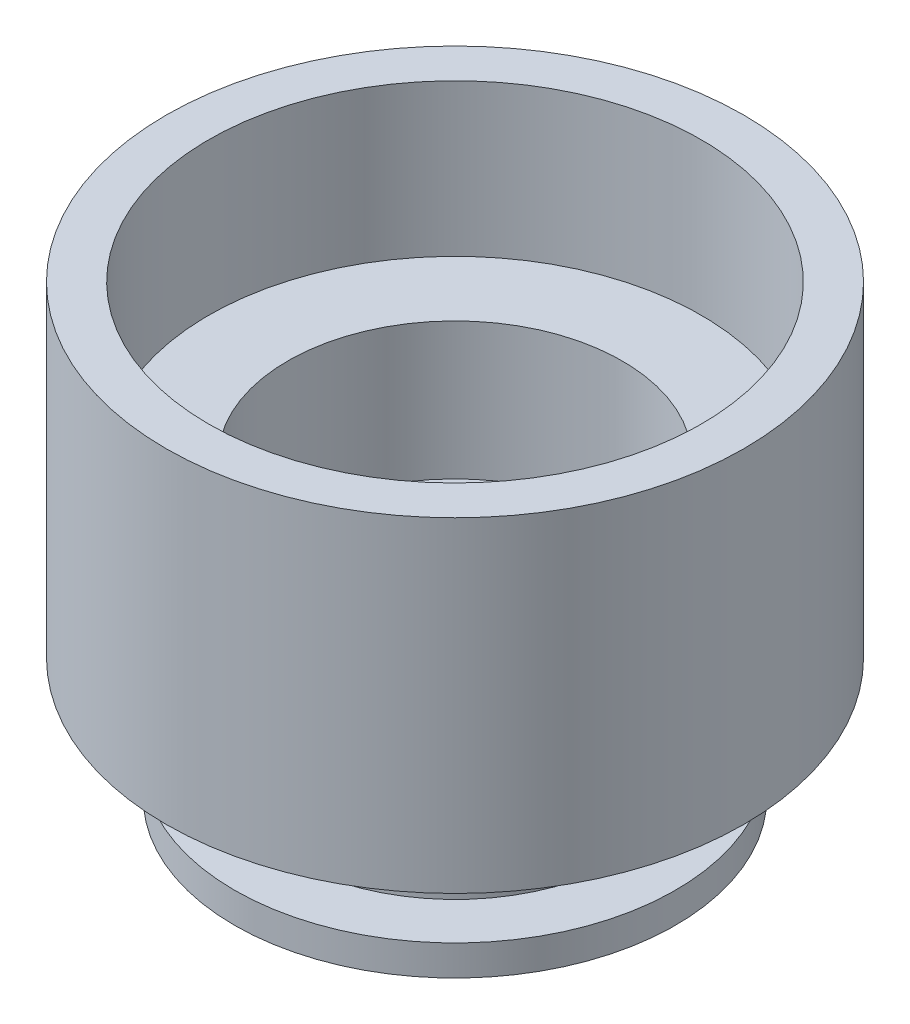
ISO-10303-21;
HEADER;
FILE_DESCRIPTION(('STEP AP214'),'2;1');
FILE_NAME('part.step','',(''),(''),'','','');
FILE_SCHEMA(('AUTOMOTIVE_DESIGN { 1 0 10303 214 1 1 1 1 }'));
ENDSEC;
DATA;
#1=APPLICATION_CONTEXT('core data for automotive mechanical design processes');
#2=APPLICATION_PROTOCOL_DEFINITION('international standard','automotive_design',2000,#1);
#3=PRODUCT_CONTEXT('',#1,'mechanical');
#4=PRODUCT('Part','Part','',(#3));
#5=PRODUCT_RELATED_PRODUCT_CATEGORY('part','',(#4));
#6=PRODUCT_DEFINITION_FORMATION('','',#4);
#7=PRODUCT_DEFINITION_CONTEXT('part definition',#1,'design');
#8=PRODUCT_DEFINITION('design','',#6,#7);
#9=PRODUCT_DEFINITION_SHAPE('','',#8);
#10=(LENGTH_UNIT() NAMED_UNIT(*) SI_UNIT(.MILLI.,.METRE.));
#11=(NAMED_UNIT(*) PLANE_ANGLE_UNIT() SI_UNIT($,.RADIAN.));
#12=(NAMED_UNIT(*) SI_UNIT($,.STERADIAN.) SOLID_ANGLE_UNIT());
#13=UNCERTAINTY_MEASURE_WITH_UNIT(LENGTH_MEASURE(1.E-05),#10,'distance_accuracy_value','');
#14=(GEOMETRIC_REPRESENTATION_CONTEXT(3) GLOBAL_UNCERTAINTY_ASSIGNED_CONTEXT((#13)) GLOBAL_UNIT_ASSIGNED_CONTEXT((#10,
#11,#12)) REPRESENTATION_CONTEXT('',''));
#15=CARTESIAN_POINT('',(0.,0.,0.));
#16=DIRECTION('',(0.,0.,1.));
#17=DIRECTION('',(1.,0.,0.));
#18=AXIS2_PLACEMENT_3D('',#15,#16,#17);
#19=CARTESIAN_POINT('',(0.,1.,0.));
#20=DIRECTION('',(0.,1.,0.));
#21=DIRECTION('',(0.,0.,1.));
#22=AXIS2_PLACEMENT_3D('',#19,#20,#21);
#23=PLANE('',#22);
#24=CARTESIAN_POINT('',(0.,1.,0.));
#25=DIRECTION('',(0.,1.,0.));
#26=DIRECTION('',(0.,0.,1.));
#27=AXIS2_PLACEMENT_3D('',#24,#25,#26);
#28=CIRCLE('',#27,7.25);
#29=CARTESIAN_POINT('',(0.,1.,7.25));
#30=VERTEX_POINT('',#29);
#31=EDGE_CURVE('E44',#30,#30,#28,.T.);
#32=ORIENTED_EDGE('',*,*,#31,.T.);
#33=EDGE_LOOP('',(#32));
#34=FACE_BOUND('',#33,.T.);
#35=CARTESIAN_POINT('',(0.,1.,0.));
#36=DIRECTION('',(0.,1.,0.));
#37=DIRECTION('',(0.,0.,1.));
#38=AXIS2_PLACEMENT_3D('',#35,#36,#37);
#39=CIRCLE('',#38,5.5);
#40=CARTESIAN_POINT('',(0.,1.,5.5));
#41=VERTEX_POINT('',#40);
#42=EDGE_CURVE('E54',#41,#41,#39,.T.);
#43=ORIENTED_EDGE('',*,*,#42,.F.);
#44=EDGE_LOOP('',(#43));
#45=FACE_BOUND('',#44,.T.);
#46=ADVANCED_FACE('F33',(#34,#45),#23,.T.);
#47=CARTESIAN_POINT('',(0.,1.,0.));
#48=DIRECTION('',(0.,-1.,0.));
#49=DIRECTION('',(0.,0.,-1.));
#50=AXIS2_PLACEMENT_3D('',#47,#48,#49);
#51=CYLINDRICAL_SURFACE('',#50,7.25);
#52=ORIENTED_EDGE('',*,*,#31,.F.);
#53=EDGE_LOOP('',(#52));
#54=FACE_BOUND('',#53,.T.);
#55=CARTESIAN_POINT('',(0.,0.,0.));
#56=DIRECTION('',(0.,1.,0.));
#57=DIRECTION('',(0.,0.,1.));
#58=AXIS2_PLACEMENT_3D('',#55,#56,#57);
#59=CIRCLE('',#58,7.25);
#60=CARTESIAN_POINT('',(0.,0.,7.25));
#61=VERTEX_POINT('',#60);
#62=EDGE_CURVE('E48',#61,#61,#59,.T.);
#63=ORIENTED_EDGE('',*,*,#62,.T.);
#64=EDGE_LOOP('',(#63));
#65=FACE_BOUND('',#64,.T.);
#66=ADVANCED_FACE('F35',(#54,#65),#51,.T.);
#67=CARTESIAN_POINT('',(0.,0.,0.));
#68=DIRECTION('',(0.,1.,0.));
#69=DIRECTION('',(0.,0.,1.));
#70=AXIS2_PLACEMENT_3D('',#67,#68,#69);
#71=PLANE('',#70);
#72=ORIENTED_EDGE('',*,*,#62,.F.);
#73=EDGE_LOOP('',(#72));
#74=FACE_BOUND('',#73,.T.);
#75=ADVANCED_FACE('F95',(#74),#71,.F.);
#76=CARTESIAN_POINT('',(0.,4.,0.));
#77=DIRECTION('',(0.,-1.,0.));
#78=DIRECTION('',(0.,0.,-1.));
#79=AXIS2_PLACEMENT_3D('',#76,#77,#78);
#80=CYLINDRICAL_SURFACE('',#79,5.5);
#81=CARTESIAN_POINT('',(0.,4.,0.));
#82=DIRECTION('',(0.,1.,0.));
#83=DIRECTION('',(0.,0.,1.));
#84=AXIS2_PLACEMENT_3D('',#81,#82,#83);
#85=CIRCLE('',#84,5.5);
#86=CARTESIAN_POINT('',(0.,4.,5.5));
#87=VERTEX_POINT('',#86);
#88=EDGE_CURVE('E52',#87,#87,#85,.T.);
#89=ORIENTED_EDGE('',*,*,#88,.F.);
#90=EDGE_LOOP('',(#89));
#91=FACE_BOUND('',#90,.T.);
#92=ORIENTED_EDGE('',*,*,#42,.T.);
#93=EDGE_LOOP('',(#92));
#94=FACE_BOUND('',#93,.T.);
#95=ADVANCED_FACE('F99',(#91,#94),#80,.T.);
#96=CARTESIAN_POINT('',(0.,4.,0.));
#97=DIRECTION('',(0.,1.,0.));
#98=DIRECTION('',(0.,0.,1.));
#99=AXIS2_PLACEMENT_3D('',#96,#97,#98);
#100=PLANE('',#99);
#101=CARTESIAN_POINT('',(0.,4.,0.));
#102=DIRECTION('',(0.,1.,0.));
#103=DIRECTION('',(0.,0.,1.));
#104=AXIS2_PLACEMENT_3D('',#101,#102,#103);
#105=CIRCLE('',#104,9.5);
#106=CARTESIAN_POINT('',(0.,4.,9.5));
#107=VERTEX_POINT('',#106);
#108=EDGE_CURVE('E57',#107,#107,#105,.T.);
#109=ORIENTED_EDGE('',*,*,#108,.F.);
#110=EDGE_LOOP('',(#109));
#111=FACE_BOUND('',#110,.T.);
#112=ORIENTED_EDGE('',*,*,#88,.T.);
#113=EDGE_LOOP('',(#112));
#114=FACE_BOUND('',#113,.T.);
#115=ADVANCED_FACE('F85',(#111,#114),#100,.F.);
#116=CARTESIAN_POINT('',(0.,5.2,0.));
#117=DIRECTION('',(0.,-1.,0.));
#118=DIRECTION('',(0.,0.,-1.));
#119=AXIS2_PLACEMENT_3D('',#116,#117,#118);
#120=CYLINDRICAL_SURFACE('',#119,9.5);
#121=ORIENTED_EDGE('',*,*,#108,.T.);
#122=EDGE_LOOP('',(#121));
#123=FACE_BOUND('',#122,.T.);
#124=CARTESIAN_POINT('',(0.,14.7,0.));
#125=DIRECTION('',(0.,1.,0.));
#126=DIRECTION('',(0.,0.,1.));
#127=AXIS2_PLACEMENT_3D('',#124,#125,#126);
#128=CIRCLE('',#127,9.5);
#129=CARTESIAN_POINT('',(0.,14.7,9.5));
#130=VERTEX_POINT('',#129);
#131=EDGE_CURVE('E65',#130,#130,#128,.T.);
#132=ORIENTED_EDGE('',*,*,#131,.F.);
#133=EDGE_LOOP('',(#132));
#134=FACE_BOUND('',#133,.T.);
#135=ADVANCED_FACE('F76',(#123,#134),#120,.T.);
#136=CARTESIAN_POINT('',(0.,14.7,0.));
#137=DIRECTION('',(0.,1.,0.));
#138=DIRECTION('',(0.,0.,1.));
#139=AXIS2_PLACEMENT_3D('',#136,#137,#138);
#140=PLANE('',#139);
#141=ORIENTED_EDGE('',*,*,#131,.T.);
#142=EDGE_LOOP('',(#141));
#143=FACE_BOUND('',#142,.T.);
#144=CARTESIAN_POINT('',(0.,14.7,0.));
#145=DIRECTION('',(0.,1.,0.));
#146=DIRECTION('',(0.,0.,1.));
#147=AXIS2_PLACEMENT_3D('',#144,#145,#146);
#148=CIRCLE('',#147,8.1);
#149=CARTESIAN_POINT('',(0.,14.7,8.1));
#150=VERTEX_POINT('',#149);
#151=EDGE_CURVE('E68',#150,#150,#148,.T.);
#152=ORIENTED_EDGE('',*,*,#151,.F.);
#153=EDGE_LOOP('',(#152));
#154=FACE_BOUND('',#153,.T.);
#155=ADVANCED_FACE('F74',(#143,#154),#140,.T.);
#156=CARTESIAN_POINT('',(0.,14.7,0.));
#157=DIRECTION('',(0.,-1.,0.));
#158=DIRECTION('',(0.,0.,-1.));
#159=AXIS2_PLACEMENT_3D('',#156,#157,#158);
#160=CYLINDRICAL_SURFACE('',#159,8.1);
#161=ORIENTED_EDGE('',*,*,#151,.T.);
#162=EDGE_LOOP('',(#161));
#163=FACE_BOUND('',#162,.T.);
#164=CARTESIAN_POINT('',(0.,9.7,0.));
#165=DIRECTION('',(0.,1.,0.));
#166=DIRECTION('',(0.,0.,1.));
#167=AXIS2_PLACEMENT_3D('',#164,#165,#166);
#168=CIRCLE('',#167,8.1);
#169=CARTESIAN_POINT('',(0.,9.7,8.1));
#170=VERTEX_POINT('',#169);
#171=EDGE_CURVE('E10',#170,#170,#168,.F.);
#172=ORIENTED_EDGE('',*,*,#171,.T.);
#173=EDGE_LOOP('',(#172));
#174=FACE_BOUND('',#173,.T.);
#175=ADVANCED_FACE('F72',(#163,#174),#160,.F.);
#176=CARTESIAN_POINT('',(0.,5.2,0.));
#177=DIRECTION('',(0.,1.,0.));
#178=DIRECTION('',(0.,0.,1.));
#179=AXIS2_PLACEMENT_3D('',#176,#177,#178);
#180=PLANE('',#179);
#181=CARTESIAN_POINT('',(0.,5.2,0.));
#182=DIRECTION('',(0.,1.,0.));
#183=DIRECTION('',(0.,0.,1.));
#184=AXIS2_PLACEMENT_3D('',#181,#182,#183);
#185=CIRCLE('',#184,5.5);
#186=CARTESIAN_POINT('',(0.,5.2,5.5));
#187=VERTEX_POINT('',#186);
#188=EDGE_CURVE('E40',#187,#187,#185,.F.);
#189=ORIENTED_EDGE('',*,*,#188,.F.);
#190=EDGE_LOOP('',(#189));
#191=FACE_BOUND('',#190,.T.);
#192=ADVANCED_FACE('F83',(#191),#180,.T.);
#193=CARTESIAN_POINT('',(0.,9.7,0.));
#194=DIRECTION('',(0.,-1.,0.));
#195=DIRECTION('',(0.,0.,-1.));
#196=AXIS2_PLACEMENT_3D('',#193,#194,#195);
#197=CYLINDRICAL_SURFACE('',#196,5.5);
#198=CARTESIAN_POINT('',(0.,9.7,0.));
#199=DIRECTION('',(0.,1.,0.));
#200=DIRECTION('',(0.,0.,1.));
#201=AXIS2_PLACEMENT_3D('',#198,#199,#200);
#202=CIRCLE('',#201,5.5);
#203=CARTESIAN_POINT('',(0.,9.7,5.5));
#204=VERTEX_POINT('',#203);
#205=EDGE_CURVE('E62',#204,#204,#202,.T.);
#206=ORIENTED_EDGE('',*,*,#205,.T.);
#207=EDGE_LOOP('',(#206));
#208=FACE_BOUND('',#207,.T.);
#209=ORIENTED_EDGE('',*,*,#188,.T.);
#210=EDGE_LOOP('',(#209));
#211=FACE_BOUND('',#210,.T.);
#212=ADVANCED_FACE('F123',(#208,#211),#197,.F.);
#213=CARTESIAN_POINT('',(0.,9.7,0.));
#214=DIRECTION('',(0.,1.,0.));
#215=DIRECTION('',(0.,0.,1.));
#216=AXIS2_PLACEMENT_3D('',#213,#214,#215);
#217=PLANE('',#216);
#218=ORIENTED_EDGE('',*,*,#171,.F.);
#219=EDGE_LOOP('',(#218));
#220=FACE_BOUND('',#219,.T.);
#221=ORIENTED_EDGE('',*,*,#205,.F.);
#222=EDGE_LOOP('',(#221));
#223=FACE_BOUND('',#222,.T.);
#224=ADVANCED_FACE('F125',(#220,#223),#217,.T.);
#225=CLOSED_SHELL('',(#46,#66,#75,#95,#115,#135,#155,#175,#192,#212,#224));
#226=MANIFOLD_SOLID_BREP('B2',#225);
#227=ADVANCED_BREP_SHAPE_REPRESENTATION('',(#18,#226),#14);
#228=SHAPE_DEFINITION_REPRESENTATION(#9,#227);
ENDSEC;
END-ISO-10303-21;
